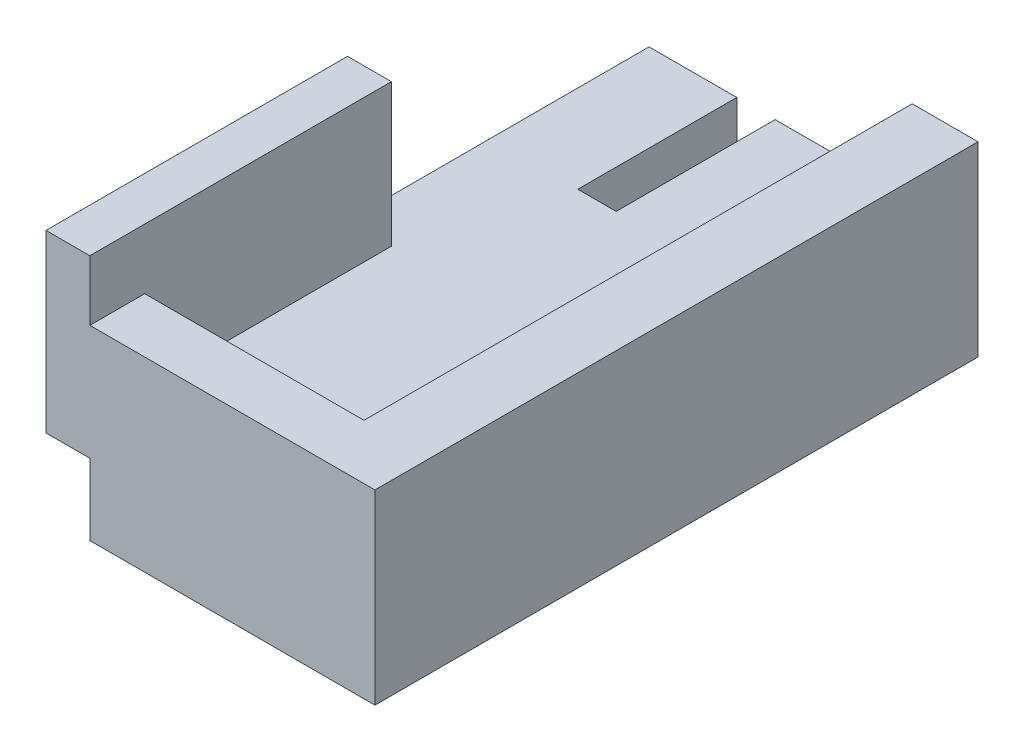
ISO-10303-21;
HEADER;
FILE_DESCRIPTION(('STEP AP214'),'2;1');
FILE_NAME('part.step','',(''),(''),'','','');
FILE_SCHEMA(('AUTOMOTIVE_DESIGN { 1 0 10303 214 1 1 1 1 }'));
ENDSEC;
DATA;
#1=APPLICATION_CONTEXT('core data for automotive mechanical design processes');
#2=APPLICATION_PROTOCOL_DEFINITION('international standard','automotive_design',2000,#1);
#3=PRODUCT_CONTEXT('',#1,'mechanical');
#4=PRODUCT('Part','Part','',(#3));
#5=PRODUCT_RELATED_PRODUCT_CATEGORY('part','',(#4));
#6=PRODUCT_DEFINITION_FORMATION('','',#4);
#7=PRODUCT_DEFINITION_CONTEXT('part definition',#1,'design');
#8=PRODUCT_DEFINITION('design','',#6,#7);
#9=PRODUCT_DEFINITION_SHAPE('','',#8);
#10=(LENGTH_UNIT() NAMED_UNIT(*) SI_UNIT(.MILLI.,.METRE.));
#11=(NAMED_UNIT(*) PLANE_ANGLE_UNIT() SI_UNIT($,.RADIAN.));
#12=(NAMED_UNIT(*) SI_UNIT($,.STERADIAN.) SOLID_ANGLE_UNIT());
#13=UNCERTAINTY_MEASURE_WITH_UNIT(LENGTH_MEASURE(1.E-05),#10,'distance_accuracy_value','');
#14=(GEOMETRIC_REPRESENTATION_CONTEXT(3) GLOBAL_UNCERTAINTY_ASSIGNED_CONTEXT((#13)) GLOBAL_UNIT_ASSIGNED_CONTEXT((#10,
#11,#12)) REPRESENTATION_CONTEXT('',''));
#15=CARTESIAN_POINT('',(0.,0.,0.));
#16=DIRECTION('',(0.,0.,1.));
#17=DIRECTION('',(1.,0.,0.));
#18=AXIS2_PLACEMENT_3D('',#15,#16,#17);
#19=CARTESIAN_POINT('',(-32.5,0.,110.));
#20=DIRECTION('',(-1.,0.,0.));
#21=DIRECTION('',(0.,0.,1.));
#22=AXIS2_PLACEMENT_3D('',#19,#20,#21);
#23=PLANE('',#22);
#24=DIRECTION('',(0.,0.,-1.));
#25=VECTOR('',#24,1.);
#26=CARTESIAN_POINT('',(-32.5,-22.5,110.));
#27=LINE('',#26,#25);
#28=CARTESIAN_POINT('',(-32.5,-22.5,42.5));
#29=VERTEX_POINT('',#28);
#30=CARTESIAN_POINT('',(-32.5,-22.5,0.));
#31=VERTEX_POINT('',#30);
#32=EDGE_CURVE('E209',#29,#31,#27,.T.);
#33=ORIENTED_EDGE('',*,*,#32,.F.);
#34=DIRECTION('',(0.,1.,0.));
#35=VECTOR('',#34,1.);
#36=CARTESIAN_POINT('',(-32.5,-22.5,42.5));
#37=LINE('',#36,#35);
#38=CARTESIAN_POINT('',(-32.5,-16.5,42.5));
#39=VERTEX_POINT('',#38);
#40=EDGE_CURVE('E204',#29,#39,#37,.T.);
#41=ORIENTED_EDGE('',*,*,#40,.T.);
#42=DIRECTION('',(0.,0.,1.));
#43=VECTOR('',#42,1.);
#44=CARTESIAN_POINT('',(-32.5,-16.5,67.5));
#45=LINE('',#44,#43);
#46=CARTESIAN_POINT('',(-32.5,-16.5,67.5));
#47=VERTEX_POINT('',#46);
#48=EDGE_CURVE('E349',#39,#47,#45,.T.);
#49=ORIENTED_EDGE('',*,*,#48,.T.);
#50=DIRECTION('',(0.,-1.,0.));
#51=VECTOR('',#50,1.);
#52=CARTESIAN_POINT('',(-32.5,-22.5,67.5));
#53=LINE('',#52,#51);
#54=CARTESIAN_POINT('',(-32.5,-22.5,67.5));
#55=VERTEX_POINT('',#54);
#56=EDGE_CURVE('E346',#47,#55,#53,.T.);
#57=ORIENTED_EDGE('',*,*,#56,.T.);
#58=CARTESIAN_POINT('',(-32.5,-22.5,96.));
#59=VERTEX_POINT('',#58);
#60=EDGE_CURVE('E217',#59,#55,#27,.T.);
#61=ORIENTED_EDGE('',*,*,#60,.F.);
#62=DIRECTION('',(0.,-1.,0.));
#63=VECTOR('',#62,1.);
#64=CARTESIAN_POINT('',(-32.5,-22.5,96.));
#65=LINE('',#64,#63);
#66=CARTESIAN_POINT('',(-32.5,-9.5,96.));
#67=VERTEX_POINT('',#66);
#68=EDGE_CURVE('E266',#67,#59,#65,.T.);
#69=ORIENTED_EDGE('',*,*,#68,.F.);
#70=DIRECTION('',(0.,0.,1.));
#71=VECTOR('',#70,1.);
#72=CARTESIAN_POINT('',(-32.5,-9.5,96.));
#73=LINE('',#72,#71);
#74=CARTESIAN_POINT('',(-32.5,-9.5,110.));
#75=VERTEX_POINT('',#74);
#76=EDGE_CURVE('E256',#67,#75,#73,.T.);
#77=ORIENTED_EDGE('',*,*,#76,.T.);
#78=DIRECTION('',(0.,1.,0.));
#79=VECTOR('',#78,1.);
#80=CARTESIAN_POINT('',(-32.5,0.,110.));
#81=LINE('',#80,#79);
#82=CARTESIAN_POINT('',(-32.5,22.5,110.));
#83=VERTEX_POINT('',#82);
#84=EDGE_CURVE('E252',#75,#83,#81,.T.);
#85=ORIENTED_EDGE('',*,*,#84,.T.);
#86=DIRECTION('',(0.,0.,-1.));
#87=VECTOR('',#86,1.);
#88=CARTESIAN_POINT('',(-32.5,22.5,110.));
#89=LINE('',#88,#87);
#90=CARTESIAN_POINT('',(-32.5,22.5,55.));
#91=VERTEX_POINT('',#90);
#92=EDGE_CURVE('E220',#83,#91,#89,.T.);
#93=ORIENTED_EDGE('',*,*,#92,.T.);
#94=DIRECTION('',(0.,-1.,0.));
#95=VECTOR('',#94,1.);
#96=CARTESIAN_POINT('',(-32.5,22.5,55.));
#97=LINE('',#96,#95);
#98=CARTESIAN_POINT('',(-32.5,-3.5,55.));
#99=VERTEX_POINT('',#98);
#100=EDGE_CURVE('E285',#91,#99,#97,.T.);
#101=ORIENTED_EDGE('',*,*,#100,.T.);
#102=DIRECTION('',(0.,0.,1.));
#103=VECTOR('',#102,1.);
#104=CARTESIAN_POINT('',(-32.5,-3.5,0.));
#105=LINE('',#104,#103);
#106=CARTESIAN_POINT('',(-32.5,-3.5,0.));
#107=VERTEX_POINT('',#106);
#108=EDGE_CURVE('E299',#107,#99,#105,.T.);
#109=ORIENTED_EDGE('',*,*,#108,.F.);
#110=DIRECTION('',(0.,1.,0.));
#111=VECTOR('',#110,1.);
#112=CARTESIAN_POINT('',(-32.5,0.,0.));
#113=LINE('',#112,#111);
#114=EDGE_CURVE('E210',#31,#107,#113,.T.);
#115=ORIENTED_EDGE('',*,*,#114,.F.);
#116=EDGE_LOOP('',(#33,#41,#49,#57,#61,#69,#77,#85,#93,#101,#109,#115));
#117=FACE_BOUND('',#116,.T.);
#118=ADVANCED_FACE('F36',(#117),#23,.T.);
#119=CARTESIAN_POINT('',(0.,-22.5,110.));
#120=DIRECTION('',(0.,1.,0.));
#121=DIRECTION('',(0.,0.,1.));
#122=AXIS2_PLACEMENT_3D('',#119,#120,#121);
#123=PLANE('',#122);
#124=DIRECTION('',(1.,0.,0.));
#125=VECTOR('',#124,1.);
#126=CARTESIAN_POINT('',(0.,-22.5,0.));
#127=LINE('',#126,#125);
#128=CARTESIAN_POINT('',(27.5,-22.5,0.));
#129=VERTEX_POINT('',#128);
#130=EDGE_CURVE('E187',#31,#129,#127,.T.);
#131=ORIENTED_EDGE('',*,*,#130,.T.);
#132=DIRECTION('',(0.,0.,1.));
#133=VECTOR('',#132,1.);
#134=CARTESIAN_POINT('',(27.5,-22.5,0.));
#135=LINE('',#134,#133);
#136=CARTESIAN_POINT('',(27.5,-22.5,110.));
#137=VERTEX_POINT('',#136);
#138=EDGE_CURVE('E197',#129,#137,#135,.T.);
#139=ORIENTED_EDGE('',*,*,#138,.T.);
#140=DIRECTION('',(1.,0.,0.));
#141=VECTOR('',#140,1.);
#142=CARTESIAN_POINT('',(0.,-22.5,110.));
#143=LINE('',#142,#141);
#144=CARTESIAN_POINT('',(-24.5,-22.5,110.));
#145=VERTEX_POINT('',#144);
#146=EDGE_CURVE('E254',#145,#137,#143,.T.);
#147=ORIENTED_EDGE('',*,*,#146,.F.);
#148=DIRECTION('',(0.,0.,1.));
#149=VECTOR('',#148,1.);
#150=CARTESIAN_POINT('',(-24.5,-22.5,96.));
#151=LINE('',#150,#149);
#152=CARTESIAN_POINT('',(-24.5,-22.5,96.));
#153=VERTEX_POINT('',#152);
#154=EDGE_CURVE('E248',#153,#145,#151,.T.);
#155=ORIENTED_EDGE('',*,*,#154,.F.);
#156=DIRECTION('',(1.,0.,0.));
#157=VECTOR('',#156,1.);
#158=CARTESIAN_POINT('',(-32.5,-22.5,96.));
#159=LINE('',#158,#157);
#160=EDGE_CURVE('E276',#59,#153,#159,.T.);
#161=ORIENTED_EDGE('',*,*,#160,.F.);
#162=ORIENTED_EDGE('',*,*,#60,.T.);
#163=DIRECTION('',(-1.,0.,0.));
#164=VECTOR('',#163,1.);
#165=CARTESIAN_POINT('',(-22.5,-22.5,67.5));
#166=LINE('',#165,#164);
#167=CARTESIAN_POINT('',(-22.5,-22.5,67.5));
#168=VERTEX_POINT('',#167);
#169=EDGE_CURVE('E341',#168,#55,#166,.T.);
#170=ORIENTED_EDGE('',*,*,#169,.F.);
#171=DIRECTION('',(0.,0.,-1.));
#172=VECTOR('',#171,1.);
#173=CARTESIAN_POINT('',(-22.5,-22.5,67.5));
#174=LINE('',#173,#172);
#175=CARTESIAN_POINT('',(-22.5,-22.5,42.5));
#176=VERTEX_POINT('',#175);
#177=EDGE_CURVE('E345',#168,#176,#174,.T.);
#178=ORIENTED_EDGE('',*,*,#177,.T.);
#179=DIRECTION('',(-1.,0.,0.));
#180=VECTOR('',#179,1.);
#181=CARTESIAN_POINT('',(-22.5,-22.5,42.5));
#182=LINE('',#181,#180);
#183=EDGE_CURVE('E343',#176,#29,#182,.T.);
#184=ORIENTED_EDGE('',*,*,#183,.T.);
#185=ORIENTED_EDGE('',*,*,#32,.T.);
#186=EDGE_LOOP('',(#131,#139,#147,#155,#161,#162,#170,#178,#184,#185));
#187=FACE_BOUND('',#186,.T.);
#188=ADVANCED_FACE('F206',(#187),#123,.F.);
#189=CARTESIAN_POINT('',(0.,11.5,110.));
#190=DIRECTION('',(0.,1.,0.));
#191=DIRECTION('',(0.,0.,1.));
#192=AXIS2_PLACEMENT_3D('',#189,#190,#191);
#193=PLANE('',#192);
#194=DIRECTION('',(0.,0.,1.));
#195=VECTOR('',#194,1.);
#196=CARTESIAN_POINT('',(15.5,11.5,110.));
#197=LINE('',#196,#195);
#198=CARTESIAN_POINT('',(15.5,11.5,0.));
#199=VERTEX_POINT('',#198);
#200=CARTESIAN_POINT('',(15.5,11.5,100.));
#201=VERTEX_POINT('',#200);
#202=EDGE_CURVE('E281',#199,#201,#197,.T.);
#203=ORIENTED_EDGE('',*,*,#202,.T.);
#204=DIRECTION('',(-1.,0.,0.));
#205=VECTOR('',#204,1.);
#206=CARTESIAN_POINT('',(0.,11.5,100.));
#207=LINE('',#206,#205);
#208=CARTESIAN_POINT('',(-24.5,11.5,100.));
#209=VERTEX_POINT('',#208);
#210=EDGE_CURVE('E239',#201,#209,#207,.T.);
#211=ORIENTED_EDGE('',*,*,#210,.T.);
#212=DIRECTION('',(0.,0.,-1.));
#213=VECTOR('',#212,1.);
#214=CARTESIAN_POINT('',(-24.5,11.5,110.));
#215=LINE('',#214,#213);
#216=CARTESIAN_POINT('',(-24.5,11.5,110.));
#217=VERTEX_POINT('',#216);
#218=EDGE_CURVE('E44',#217,#209,#215,.T.);
#219=ORIENTED_EDGE('',*,*,#218,.F.);
#220=DIRECTION('',(1.,0.,0.));
#221=VECTOR('',#220,1.);
#222=CARTESIAN_POINT('',(0.,11.5,110.));
#223=LINE('',#222,#221);
#224=CARTESIAN_POINT('',(27.5,11.5,110.));
#225=VERTEX_POINT('',#224);
#226=EDGE_CURVE('E194',#217,#225,#223,.T.);
#227=ORIENTED_EDGE('',*,*,#226,.T.);
#228=DIRECTION('',(0.,0.,-1.));
#229=VECTOR('',#228,1.);
#230=CARTESIAN_POINT('',(27.5,11.5,110.));
#231=LINE('',#230,#229);
#232=CARTESIAN_POINT('',(27.5,11.5,0.));
#233=VERTEX_POINT('',#232);
#234=EDGE_CURVE('E215',#225,#233,#231,.T.);
#235=ORIENTED_EDGE('',*,*,#234,.T.);
#236=DIRECTION('',(1.,0.,0.));
#237=VECTOR('',#236,1.);
#238=CARTESIAN_POINT('',(0.,11.5,0.));
#239=LINE('',#238,#237);
#240=EDGE_CURVE('E191',#199,#233,#239,.T.);
#241=ORIENTED_EDGE('',*,*,#240,.F.);
#242=EDGE_LOOP('',(#203,#211,#219,#227,#235,#241));
#243=FACE_BOUND('',#242,.T.);
#244=ADVANCED_FACE('F38',(#243),#193,.T.);
#245=CARTESIAN_POINT('',(0.,0.,0.));
#246=DIRECTION('',(0.,0.,1.));
#247=DIRECTION('',(1.,0.,0.));
#248=AXIS2_PLACEMENT_3D('',#245,#246,#247);
#249=PLANE('',#248);
#250=DIRECTION('',(0.,-1.,0.));
#251=VECTOR('',#250,1.);
#252=CARTESIAN_POINT('',(27.5,0.,0.));
#253=LINE('',#252,#251);
#254=EDGE_CURVE('E182',#233,#129,#253,.T.);
#255=ORIENTED_EDGE('',*,*,#254,.T.);
#256=ORIENTED_EDGE('',*,*,#130,.F.);
#257=ORIENTED_EDGE('',*,*,#114,.T.);
#258=DIRECTION('',(-1.,0.,0.));
#259=VECTOR('',#258,1.);
#260=CARTESIAN_POINT('',(0.,-3.5,0.));
#261=LINE('',#260,#259);
#262=CARTESIAN_POINT('',(-16.5,-3.5,0.));
#263=VERTEX_POINT('',#262);
#264=EDGE_CURVE('E305',#263,#107,#261,.T.);
#265=ORIENTED_EDGE('',*,*,#264,.F.);
#266=DIRECTION('',(0.,1.,0.));
#267=VECTOR('',#266,1.);
#268=CARTESIAN_POINT('',(-16.5,-3.5,0.));
#269=LINE('',#268,#267);
#270=CARTESIAN_POINT('',(-16.5,-10.5,0.));
#271=VERTEX_POINT('',#270);
#272=EDGE_CURVE('E327',#271,#263,#269,.T.);
#273=ORIENTED_EDGE('',*,*,#272,.F.);
#274=DIRECTION('',(-1.,0.,0.));
#275=VECTOR('',#274,1.);
#276=CARTESIAN_POINT('',(-16.5,-10.5,0.));
#277=LINE('',#276,#275);
#278=CARTESIAN_POINT('',(-9.50000000000001,-10.5,0.));
#279=VERTEX_POINT('',#278);
#280=EDGE_CURVE('E321',#279,#271,#277,.T.);
#281=ORIENTED_EDGE('',*,*,#280,.F.);
#282=DIRECTION('',(0.,-1.,0.));
#283=VECTOR('',#282,1.);
#284=CARTESIAN_POINT('',(-9.50000000000001,-3.5,0.));
#285=LINE('',#284,#283);
#286=CARTESIAN_POINT('',(-9.50000000000001,-3.5,0.));
#287=VERTEX_POINT('',#286);
#288=EDGE_CURVE('E324',#287,#279,#285,.T.);
#289=ORIENTED_EDGE('',*,*,#288,.F.);
#290=CARTESIAN_POINT('',(15.5,-3.5,0.));
#291=VERTEX_POINT('',#290);
#292=EDGE_CURVE('E302',#291,#287,#261,.T.);
#293=ORIENTED_EDGE('',*,*,#292,.F.);
#294=DIRECTION('',(0.,-1.,0.));
#295=VECTOR('',#294,1.);
#296=CARTESIAN_POINT('',(15.5,0.,0.));
#297=LINE('',#296,#295);
#298=EDGE_CURVE('E11',#199,#291,#297,.T.);
#299=ORIENTED_EDGE('',*,*,#298,.F.);
#300=ORIENTED_EDGE('',*,*,#240,.T.);
#301=EDGE_LOOP('',(#255,#256,#257,#265,#273,#281,#289,#293,#299,#300));
#302=FACE_BOUND('',#301,.T.);
#303=ADVANCED_FACE('F184',(#302),#249,.F.);
#304=CARTESIAN_POINT('',(-24.5,0.,110.));
#305=DIRECTION('',(1.,0.,0.));
#306=DIRECTION('',(0.,1.,0.));
#307=AXIS2_PLACEMENT_3D('',#304,#305,#306);
#308=PLANE('',#307);
#309=DIRECTION('',(0.,-1.,0.));
#310=VECTOR('',#309,1.);
#311=CARTESIAN_POINT('',(-24.5,22.5,55.));
#312=LINE('',#311,#310);
#313=CARTESIAN_POINT('',(-24.5,22.5,55.));
#314=VERTEX_POINT('',#313);
#315=CARTESIAN_POINT('',(-24.5,-3.5,55.));
#316=VERTEX_POINT('',#315);
#317=EDGE_CURVE('E288',#314,#316,#312,.T.);
#318=ORIENTED_EDGE('',*,*,#317,.F.);
#319=DIRECTION('',(0.,0.,-1.));
#320=VECTOR('',#319,1.);
#321=CARTESIAN_POINT('',(-24.5,22.5,110.));
#322=LINE('',#321,#320);
#323=CARTESIAN_POINT('',(-24.5,22.5,110.));
#324=VERTEX_POINT('',#323);
#325=EDGE_CURVE('E223',#324,#314,#322,.T.);
#326=ORIENTED_EDGE('',*,*,#325,.F.);
#327=DIRECTION('',(0.,-1.,0.));
#328=VECTOR('',#327,1.);
#329=CARTESIAN_POINT('',(-24.5,0.,110.));
#330=LINE('',#329,#328);
#331=EDGE_CURVE('E233',#324,#217,#330,.T.);
#332=ORIENTED_EDGE('',*,*,#331,.T.);
#333=ORIENTED_EDGE('',*,*,#218,.T.);
#334=DIRECTION('',(0.,-1.,0.));
#335=VECTOR('',#334,1.);
#336=CARTESIAN_POINT('',(-24.5,22.5,100.));
#337=LINE('',#336,#335);
#338=CARTESIAN_POINT('',(-24.5,-3.5,100.));
#339=VERTEX_POINT('',#338);
#340=EDGE_CURVE('E230',#209,#339,#337,.T.);
#341=ORIENTED_EDGE('',*,*,#340,.T.);
#342=DIRECTION('',(0.,0.,1.));
#343=VECTOR('',#342,1.);
#344=CARTESIAN_POINT('',(-24.5,-3.5,0.));
#345=LINE('',#344,#343);
#346=EDGE_CURVE('E294',#316,#339,#345,.T.);
#347=ORIENTED_EDGE('',*,*,#346,.F.);
#348=EDGE_LOOP('',(#318,#326,#332,#333,#341,#347));
#349=FACE_BOUND('',#348,.T.);
#350=ADVANCED_FACE('F228',(#349),#308,.T.);
#351=CARTESIAN_POINT('',(0.,22.5,110.));
#352=DIRECTION('',(0.,1.,0.));
#353=DIRECTION('',(0.,0.,1.));
#354=AXIS2_PLACEMENT_3D('',#351,#352,#353);
#355=PLANE('',#354);
#356=DIRECTION('',(-1.,0.,0.));
#357=VECTOR('',#356,1.);
#358=CARTESIAN_POINT('',(0.,22.5,55.));
#359=LINE('',#358,#357);
#360=EDGE_CURVE('E291',#314,#91,#359,.T.);
#361=ORIENTED_EDGE('',*,*,#360,.T.);
#362=ORIENTED_EDGE('',*,*,#92,.F.);
#363=DIRECTION('',(1.,0.,0.));
#364=VECTOR('',#363,1.);
#365=CARTESIAN_POINT('',(0.,22.5,110.));
#366=LINE('',#365,#364);
#367=EDGE_CURVE('E245',#83,#324,#366,.T.);
#368=ORIENTED_EDGE('',*,*,#367,.T.);
#369=ORIENTED_EDGE('',*,*,#325,.T.);
#370=EDGE_LOOP('',(#361,#362,#368,#369));
#371=FACE_BOUND('',#370,.T.);
#372=ADVANCED_FACE('F389',(#371),#355,.T.);
#373=CARTESIAN_POINT('',(27.5,0.,110.));
#374=DIRECTION('',(1.,0.,0.));
#375=DIRECTION('',(0.,1.,0.));
#376=AXIS2_PLACEMENT_3D('',#373,#374,#375);
#377=PLANE('',#376);
#378=ORIENTED_EDGE('',*,*,#254,.F.);
#379=ORIENTED_EDGE('',*,*,#234,.F.);
#380=DIRECTION('',(0.,-1.,0.));
#381=VECTOR('',#380,1.);
#382=CARTESIAN_POINT('',(27.5,0.,110.));
#383=LINE('',#382,#381);
#384=EDGE_CURVE('E200',#225,#137,#383,.T.);
#385=ORIENTED_EDGE('',*,*,#384,.T.);
#386=ORIENTED_EDGE('',*,*,#138,.F.);
#387=EDGE_LOOP('',(#378,#379,#385,#386));
#388=FACE_BOUND('',#387,.T.);
#389=ADVANCED_FACE('F198',(#388),#377,.T.);
#390=CARTESIAN_POINT('',(0.,0.,110.));
#391=DIRECTION('',(0.,0.,1.));
#392=DIRECTION('',(1.,0.,0.));
#393=AXIS2_PLACEMENT_3D('',#390,#391,#392);
#394=PLANE('',#393);
#395=ORIENTED_EDGE('',*,*,#146,.T.);
#396=ORIENTED_EDGE('',*,*,#384,.F.);
#397=ORIENTED_EDGE('',*,*,#226,.F.);
#398=ORIENTED_EDGE('',*,*,#331,.F.);
#399=ORIENTED_EDGE('',*,*,#367,.F.);
#400=ORIENTED_EDGE('',*,*,#84,.F.);
#401=DIRECTION('',(-1.,0.,0.));
#402=VECTOR('',#401,1.);
#403=CARTESIAN_POINT('',(-32.5,-9.5,110.));
#404=LINE('',#403,#402);
#405=CARTESIAN_POINT('',(-24.5,-9.5,110.));
#406=VERTEX_POINT('',#405);
#407=EDGE_CURVE('E264',#406,#75,#404,.T.);
#408=ORIENTED_EDGE('',*,*,#407,.F.);
#409=DIRECTION('',(0.,1.,0.));
#410=VECTOR('',#409,1.);
#411=CARTESIAN_POINT('',(-24.5,-22.5,110.));
#412=LINE('',#411,#410);
#413=EDGE_CURVE('E267',#145,#406,#412,.T.);
#414=ORIENTED_EDGE('',*,*,#413,.F.);
#415=EDGE_LOOP('',(#395,#396,#397,#398,#399,#400,#408,#414));
#416=FACE_BOUND('',#415,.T.);
#417=ADVANCED_FACE('F241',(#416),#394,.T.);
#418=CARTESIAN_POINT('',(-32.5,-9.5,96.));
#419=DIRECTION('',(0.,1.,0.));
#420=DIRECTION('',(0.,0.,1.));
#421=AXIS2_PLACEMENT_3D('',#418,#419,#420);
#422=PLANE('',#421);
#423=ORIENTED_EDGE('',*,*,#407,.T.);
#424=ORIENTED_EDGE('',*,*,#76,.F.);
#425=DIRECTION('',(-1.,0.,0.));
#426=VECTOR('',#425,1.);
#427=CARTESIAN_POINT('',(-32.5,-9.5,96.));
#428=LINE('',#427,#426);
#429=CARTESIAN_POINT('',(-24.5,-9.5,96.));
#430=VERTEX_POINT('',#429);
#431=EDGE_CURVE('E270',#430,#67,#428,.T.);
#432=ORIENTED_EDGE('',*,*,#431,.F.);
#433=DIRECTION('',(0.,0.,1.));
#434=VECTOR('',#433,1.);
#435=CARTESIAN_POINT('',(-24.5,-9.5,96.));
#436=LINE('',#435,#434);
#437=EDGE_CURVE('E258',#430,#406,#436,.T.);
#438=ORIENTED_EDGE('',*,*,#437,.T.);
#439=EDGE_LOOP('',(#423,#424,#432,#438));
#440=FACE_BOUND('',#439,.T.);
#441=ADVANCED_FACE('F406',(#440),#422,.F.);
#442=CARTESIAN_POINT('',(-24.5,-22.5,96.));
#443=DIRECTION('',(1.,0.,0.));
#444=DIRECTION('',(0.,0.,-1.));
#445=AXIS2_PLACEMENT_3D('',#442,#443,#444);
#446=PLANE('',#445);
#447=ORIENTED_EDGE('',*,*,#413,.T.);
#448=ORIENTED_EDGE('',*,*,#437,.F.);
#449=DIRECTION('',(0.,1.,0.));
#450=VECTOR('',#449,1.);
#451=CARTESIAN_POINT('',(-24.5,-22.5,96.));
#452=LINE('',#451,#450);
#453=EDGE_CURVE('E273',#153,#430,#452,.T.);
#454=ORIENTED_EDGE('',*,*,#453,.F.);
#455=ORIENTED_EDGE('',*,*,#154,.T.);
#456=EDGE_LOOP('',(#447,#448,#454,#455));
#457=FACE_BOUND('',#456,.T.);
#458=ADVANCED_FACE('F410',(#457),#446,.F.);
#459=CARTESIAN_POINT('',(0.,0.,96.));
#460=DIRECTION('',(0.,0.,-1.));
#461=DIRECTION('',(-1.,0.,0.));
#462=AXIS2_PLACEMENT_3D('',#459,#460,#461);
#463=PLANE('',#462);
#464=ORIENTED_EDGE('',*,*,#68,.T.);
#465=ORIENTED_EDGE('',*,*,#160,.T.);
#466=ORIENTED_EDGE('',*,*,#453,.T.);
#467=ORIENTED_EDGE('',*,*,#431,.T.);
#468=EDGE_LOOP('',(#464,#465,#466,#467));
#469=FACE_BOUND('',#468,.T.);
#470=ADVANCED_FACE('F416',(#469),#463,.F.);
#471=CARTESIAN_POINT('',(0.,22.5,100.));
#472=DIRECTION('',(0.,0.,-1.));
#473=DIRECTION('',(-1.,0.,0.));
#474=AXIS2_PLACEMENT_3D('',#471,#472,#473);
#475=PLANE('',#474);
#476=DIRECTION('',(0.,-1.,0.));
#477=VECTOR('',#476,1.);
#478=CARTESIAN_POINT('',(15.5,22.5,100.));
#479=LINE('',#478,#477);
#480=CARTESIAN_POINT('',(15.5,-3.5,100.));
#481=VERTEX_POINT('',#480);
#482=EDGE_CURVE('E283',#201,#481,#479,.T.);
#483=ORIENTED_EDGE('',*,*,#482,.T.);
#484=DIRECTION('',(1.,0.,0.));
#485=VECTOR('',#484,1.);
#486=CARTESIAN_POINT('',(0.,-3.5,100.));
#487=LINE('',#486,#485);
#488=EDGE_CURVE('E308',#339,#481,#487,.T.);
#489=ORIENTED_EDGE('',*,*,#488,.F.);
#490=ORIENTED_EDGE('',*,*,#340,.F.);
#491=ORIENTED_EDGE('',*,*,#210,.F.);
#492=EDGE_LOOP('',(#483,#489,#490,#491));
#493=FACE_BOUND('',#492,.T.);
#494=ADVANCED_FACE('F421',(#493),#475,.T.);
#495=CARTESIAN_POINT('',(15.5,22.5,0.));
#496=DIRECTION('',(-1.,0.,0.));
#497=DIRECTION('',(0.,0.,1.));
#498=AXIS2_PLACEMENT_3D('',#495,#496,#497);
#499=PLANE('',#498);
#500=ORIENTED_EDGE('',*,*,#298,.T.);
#501=DIRECTION('',(0.,0.,-1.));
#502=VECTOR('',#501,1.);
#503=CARTESIAN_POINT('',(15.5,-3.5,0.));
#504=LINE('',#503,#502);
#505=EDGE_CURVE('E306',#481,#291,#504,.T.);
#506=ORIENTED_EDGE('',*,*,#505,.F.);
#507=ORIENTED_EDGE('',*,*,#482,.F.);
#508=ORIENTED_EDGE('',*,*,#202,.F.);
#509=EDGE_LOOP('',(#500,#506,#507,#508));
#510=FACE_BOUND('',#509,.T.);
#511=ADVANCED_FACE('F425',(#510),#499,.T.);
#512=CARTESIAN_POINT('',(0.,22.5,55.));
#513=DIRECTION('',(0.,0.,1.));
#514=DIRECTION('',(1.,0.,0.));
#515=AXIS2_PLACEMENT_3D('',#512,#513,#514);
#516=PLANE('',#515);
#517=ORIENTED_EDGE('',*,*,#100,.F.);
#518=ORIENTED_EDGE('',*,*,#360,.F.);
#519=ORIENTED_EDGE('',*,*,#317,.T.);
#520=DIRECTION('',(-1.,0.,0.));
#521=VECTOR('',#520,1.);
#522=CARTESIAN_POINT('',(0.,-3.5,55.));
#523=LINE('',#522,#521);
#524=EDGE_CURVE('E297',#316,#99,#523,.T.);
#525=ORIENTED_EDGE('',*,*,#524,.T.);
#526=EDGE_LOOP('',(#517,#518,#519,#525));
#527=FACE_BOUND('',#526,.T.);
#528=ADVANCED_FACE('F429',(#527),#516,.F.);
#529=CARTESIAN_POINT('',(0.,-3.5,0.));
#530=DIRECTION('',(0.,1.,0.));
#531=DIRECTION('',(0.,0.,1.));
#532=AXIS2_PLACEMENT_3D('',#529,#530,#531);
#533=PLANE('',#532);
#534=DIRECTION('',(0.,0.,-1.));
#535=VECTOR('',#534,1.);
#536=CARTESIAN_POINT('',(-16.5,-3.5,29.));
#537=LINE('',#536,#535);
#538=CARTESIAN_POINT('',(-16.5,-3.5,29.));
#539=VERTEX_POINT('',#538);
#540=EDGE_CURVE('E312',#539,#263,#537,.T.);
#541=ORIENTED_EDGE('',*,*,#540,.T.);
#542=ORIENTED_EDGE('',*,*,#264,.T.);
#543=ORIENTED_EDGE('',*,*,#108,.T.);
#544=ORIENTED_EDGE('',*,*,#524,.F.);
#545=ORIENTED_EDGE('',*,*,#346,.T.);
#546=ORIENTED_EDGE('',*,*,#488,.T.);
#547=ORIENTED_EDGE('',*,*,#505,.T.);
#548=ORIENTED_EDGE('',*,*,#292,.T.);
#549=DIRECTION('',(0.,0.,-1.));
#550=VECTOR('',#549,1.);
#551=CARTESIAN_POINT('',(-9.50000000000001,-3.5,29.));
#552=LINE('',#551,#550);
#553=CARTESIAN_POINT('',(-9.50000000000001,-3.5,29.));
#554=VERTEX_POINT('',#553);
#555=EDGE_CURVE('E315',#554,#287,#552,.T.);
#556=ORIENTED_EDGE('',*,*,#555,.F.);
#557=DIRECTION('',(1.,0.,0.));
#558=VECTOR('',#557,1.);
#559=CARTESIAN_POINT('',(-16.5,-3.5,29.));
#560=LINE('',#559,#558);
#561=EDGE_CURVE('E334',#539,#554,#560,.T.);
#562=ORIENTED_EDGE('',*,*,#561,.F.);
#563=EDGE_LOOP('',(#541,#542,#543,#544,#545,#546,#547,#548,#556,#562));
#564=FACE_BOUND('',#563,.T.);
#565=ADVANCED_FACE('F433',(#564),#533,.T.);
#566=CARTESIAN_POINT('',(-16.5,-3.5,29.));
#567=DIRECTION('',(-1.,0.,0.));
#568=DIRECTION('',(0.,0.,1.));
#569=AXIS2_PLACEMENT_3D('',#566,#567,#568);
#570=PLANE('',#569);
#571=ORIENTED_EDGE('',*,*,#272,.T.);
#572=ORIENTED_EDGE('',*,*,#540,.F.);
#573=DIRECTION('',(0.,1.,0.));
#574=VECTOR('',#573,1.);
#575=CARTESIAN_POINT('',(-16.5,-3.5,29.));
#576=LINE('',#575,#574);
#577=CARTESIAN_POINT('',(-16.5,-10.5,29.));
#578=VERTEX_POINT('',#577);
#579=EDGE_CURVE('E59',#578,#539,#576,.T.);
#580=ORIENTED_EDGE('',*,*,#579,.F.);
#581=DIRECTION('',(0.,0.,-1.));
#582=VECTOR('',#581,1.);
#583=CARTESIAN_POINT('',(-16.5,-10.5,29.));
#584=LINE('',#583,#582);
#585=EDGE_CURVE('E311',#578,#271,#584,.T.);
#586=ORIENTED_EDGE('',*,*,#585,.T.);
#587=EDGE_LOOP('',(#571,#572,#580,#586));
#588=FACE_BOUND('',#587,.T.);
#589=ADVANCED_FACE('F437',(#588),#570,.F.);
#590=CARTESIAN_POINT('',(-16.5,-10.5,29.));
#591=DIRECTION('',(0.,-1.,0.));
#592=DIRECTION('',(0.,0.,-1.));
#593=AXIS2_PLACEMENT_3D('',#590,#591,#592);
#594=PLANE('',#593);
#595=ORIENTED_EDGE('',*,*,#280,.T.);
#596=ORIENTED_EDGE('',*,*,#585,.F.);
#597=DIRECTION('',(-1.,0.,0.));
#598=VECTOR('',#597,1.);
#599=CARTESIAN_POINT('',(-16.5,-10.5,29.));
#600=LINE('',#599,#598);
#601=CARTESIAN_POINT('',(-9.50000000000001,-10.5,29.));
#602=VERTEX_POINT('',#601);
#603=EDGE_CURVE('E316',#602,#578,#600,.T.);
#604=ORIENTED_EDGE('',*,*,#603,.F.);
#605=DIRECTION('',(0.,0.,-1.));
#606=VECTOR('',#605,1.);
#607=CARTESIAN_POINT('',(-9.50000000000001,-10.5,29.));
#608=LINE('',#607,#606);
#609=EDGE_CURVE('E318',#602,#279,#608,.T.);
#610=ORIENTED_EDGE('',*,*,#609,.T.);
#611=EDGE_LOOP('',(#595,#596,#604,#610));
#612=FACE_BOUND('',#611,.T.);
#613=ADVANCED_FACE('F441',(#612),#594,.F.);
#614=CARTESIAN_POINT('',(-9.50000000000001,-3.5,29.));
#615=DIRECTION('',(1.,0.,0.));
#616=DIRECTION('',(0.,1.,0.));
#617=AXIS2_PLACEMENT_3D('',#614,#615,#616);
#618=PLANE('',#617);
#619=ORIENTED_EDGE('',*,*,#288,.T.);
#620=ORIENTED_EDGE('',*,*,#609,.F.);
#621=DIRECTION('',(0.,-1.,0.));
#622=VECTOR('',#621,1.);
#623=CARTESIAN_POINT('',(-9.50000000000001,-3.5,29.));
#624=LINE('',#623,#622);
#625=EDGE_CURVE('E331',#554,#602,#624,.T.);
#626=ORIENTED_EDGE('',*,*,#625,.F.);
#627=ORIENTED_EDGE('',*,*,#555,.T.);
#628=EDGE_LOOP('',(#619,#620,#626,#627));
#629=FACE_BOUND('',#628,.T.);
#630=ADVANCED_FACE('F443',(#629),#618,.F.);
#631=CARTESIAN_POINT('',(0.,0.,29.));
#632=DIRECTION('',(0.,0.,1.));
#633=DIRECTION('',(1.,0.,0.));
#634=AXIS2_PLACEMENT_3D('',#631,#632,#633);
#635=PLANE('',#634);
#636=ORIENTED_EDGE('',*,*,#579,.T.);
#637=ORIENTED_EDGE('',*,*,#561,.T.);
#638=ORIENTED_EDGE('',*,*,#625,.T.);
#639=ORIENTED_EDGE('',*,*,#603,.T.);
#640=EDGE_LOOP('',(#636,#637,#638,#639));
#641=FACE_BOUND('',#640,.T.);
#642=ADVANCED_FACE('F446',(#641),#635,.F.);
#643=CARTESIAN_POINT('',(-22.5,-22.5,42.5));
#644=DIRECTION('',(0.,0.,1.));
#645=DIRECTION('',(1.,0.,0.));
#646=AXIS2_PLACEMENT_3D('',#643,#644,#645);
#647=PLANE('',#646);
#648=ORIENTED_EDGE('',*,*,#40,.F.);
#649=ORIENTED_EDGE('',*,*,#183,.F.);
#650=DIRECTION('',(0.,1.,0.));
#651=VECTOR('',#650,1.);
#652=CARTESIAN_POINT('',(-22.5,-22.5,42.5));
#653=LINE('',#652,#651);
#654=CARTESIAN_POINT('',(-22.5,-16.5,42.5));
#655=VERTEX_POINT('',#654);
#656=EDGE_CURVE('E51',#176,#655,#653,.T.);
#657=ORIENTED_EDGE('',*,*,#656,.T.);
#658=DIRECTION('',(-1.,0.,0.));
#659=VECTOR('',#658,1.);
#660=CARTESIAN_POINT('',(-22.5,-16.5,42.5));
#661=LINE('',#660,#659);
#662=EDGE_CURVE('E329',#655,#39,#661,.T.);
#663=ORIENTED_EDGE('',*,*,#662,.T.);
#664=EDGE_LOOP('',(#648,#649,#657,#663));
#665=FACE_BOUND('',#664,.T.);
#666=ADVANCED_FACE('F362',(#665),#647,.T.);
#667=CARTESIAN_POINT('',(-22.5,-16.5,67.5));
#668=DIRECTION('',(0.,-1.,0.));
#669=DIRECTION('',(0.,0.,-1.));
#670=AXIS2_PLACEMENT_3D('',#667,#668,#669);
#671=PLANE('',#670);
#672=ORIENTED_EDGE('',*,*,#48,.F.);
#673=ORIENTED_EDGE('',*,*,#662,.F.);
#674=DIRECTION('',(0.,0.,1.));
#675=VECTOR('',#674,1.);
#676=CARTESIAN_POINT('',(-22.5,-16.5,67.5));
#677=LINE('',#676,#675);
#678=CARTESIAN_POINT('',(-22.5,-16.5,67.5));
#679=VERTEX_POINT('',#678);
#680=EDGE_CURVE('E358',#655,#679,#677,.T.);
#681=ORIENTED_EDGE('',*,*,#680,.T.);
#682=DIRECTION('',(-1.,0.,0.));
#683=VECTOR('',#682,1.);
#684=CARTESIAN_POINT('',(-22.5,-16.5,67.5));
#685=LINE('',#684,#683);
#686=EDGE_CURVE('E339',#679,#47,#685,.T.);
#687=ORIENTED_EDGE('',*,*,#686,.T.);
#688=EDGE_LOOP('',(#672,#673,#681,#687));
#689=FACE_BOUND('',#688,.T.);
#690=ADVANCED_FACE('F364',(#689),#671,.T.);
#691=CARTESIAN_POINT('',(-22.5,-22.5,67.5));
#692=DIRECTION('',(0.,0.,-1.));
#693=DIRECTION('',(-1.,0.,0.));
#694=AXIS2_PLACEMENT_3D('',#691,#692,#693);
#695=PLANE('',#694);
#696=ORIENTED_EDGE('',*,*,#56,.F.);
#697=ORIENTED_EDGE('',*,*,#686,.F.);
#698=DIRECTION('',(0.,-1.,0.));
#699=VECTOR('',#698,1.);
#700=CARTESIAN_POINT('',(-22.5,-22.5,67.5));
#701=LINE('',#700,#699);
#702=EDGE_CURVE('E356',#679,#168,#701,.T.);
#703=ORIENTED_EDGE('',*,*,#702,.T.);
#704=ORIENTED_EDGE('',*,*,#169,.T.);
#705=EDGE_LOOP('',(#696,#697,#703,#704));
#706=FACE_BOUND('',#705,.T.);
#707=ADVANCED_FACE('F372',(#706),#695,.T.);
#708=CARTESIAN_POINT('',(-22.5,0.,0.));
#709=DIRECTION('',(-1.,0.,0.));
#710=DIRECTION('',(0.,0.,1.));
#711=AXIS2_PLACEMENT_3D('',#708,#709,#710);
#712=PLANE('',#711);
#713=ORIENTED_EDGE('',*,*,#656,.F.);
#714=ORIENTED_EDGE('',*,*,#177,.F.);
#715=ORIENTED_EDGE('',*,*,#702,.F.);
#716=ORIENTED_EDGE('',*,*,#680,.F.);
#717=EDGE_LOOP('',(#713,#714,#715,#716));
#718=FACE_BOUND('',#717,.T.);
#719=ADVANCED_FACE('F370',(#718),#712,.T.);
#720=CLOSED_SHELL('',(#118,#188,#244,#303,#350,#372,#389,#417,#441,#458,#470,#494,#511,#528,
#565,#589,#613,#630,#642,#666,#690,#707,#719));
#721=MANIFOLD_SOLID_BREP('B2',#720);
#722=ADVANCED_BREP_SHAPE_REPRESENTATION('',(#18,#721),#14);
#723=SHAPE_DEFINITION_REPRESENTATION(#9,#722);
ENDSEC;
END-ISO-10303-21;
